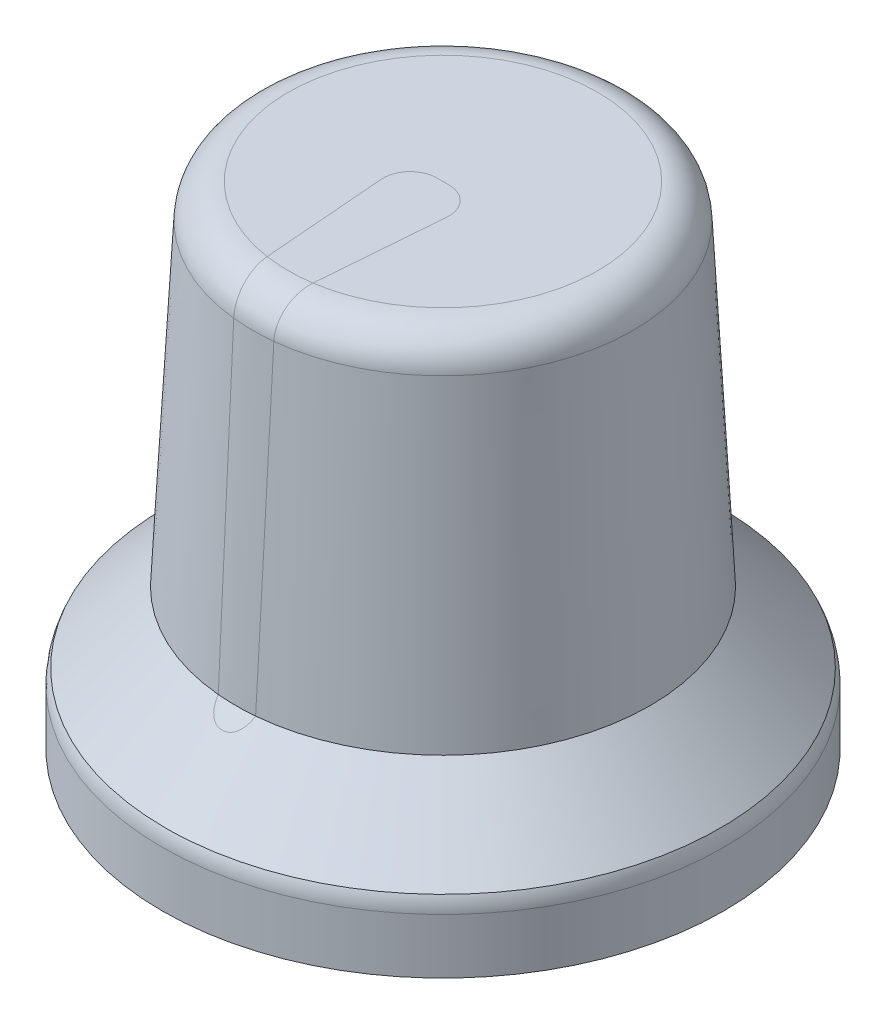
ISO-10303-21;
HEADER;
FILE_DESCRIPTION(('STEP AP214'),'2;1');
FILE_NAME('part.step','',(''),(''),'','','');
FILE_SCHEMA(('AUTOMOTIVE_DESIGN { 1 0 10303 214 1 1 1 1 }'));
ENDSEC;
DATA;
#1=APPLICATION_CONTEXT('core data for automotive mechanical design processes');
#2=APPLICATION_PROTOCOL_DEFINITION('international standard','automotive_design',2000,#1);
#3=PRODUCT_CONTEXT('',#1,'mechanical');
#4=PRODUCT('Part','Part','',(#3));
#5=PRODUCT_RELATED_PRODUCT_CATEGORY('part','',(#4));
#6=PRODUCT_DEFINITION_FORMATION('','',#4);
#7=PRODUCT_DEFINITION_CONTEXT('part definition',#1,'design');
#8=PRODUCT_DEFINITION('design','',#6,#7);
#9=PRODUCT_DEFINITION_SHAPE('','',#8);
#10=(LENGTH_UNIT() NAMED_UNIT(*) SI_UNIT(.MILLI.,.METRE.));
#11=(NAMED_UNIT(*) PLANE_ANGLE_UNIT() SI_UNIT($,.RADIAN.));
#12=(NAMED_UNIT(*) SI_UNIT($,.STERADIAN.) SOLID_ANGLE_UNIT());
#13=UNCERTAINTY_MEASURE_WITH_UNIT(LENGTH_MEASURE(1.E-05),#10,'distance_accuracy_value','');
#14=(GEOMETRIC_REPRESENTATION_CONTEXT(3) GLOBAL_UNCERTAINTY_ASSIGNED_CONTEXT((#13)) GLOBAL_UNIT_ASSIGNED_CONTEXT((#10,
#11,#12)) REPRESENTATION_CONTEXT('',''));
#15=CARTESIAN_POINT('',(0.,0.,0.));
#16=DIRECTION('',(0.,0.,1.));
#17=DIRECTION('',(1.,0.,0.));
#18=AXIS2_PLACEMENT_3D('',#15,#16,#17);
#19=CARTESIAN_POINT('',(0.,14.,0.));
#20=DIRECTION('',(0.,1.,0.));
#21=DIRECTION('',(0.,0.,1.));
#22=AXIS2_PLACEMENT_3D('',#19,#20,#21);
#23=PLANE('',#22);
#24=CARTESIAN_POINT('',(0.,14.,0.));
#25=DIRECTION('',(0.,1.,0.));
#26=DIRECTION('',(0.,0.,1.));
#27=AXIS2_PLACEMENT_3D('',#24,#25,#26);
#28=CIRCLE('',#27,4.40695864882119);
#29=CARTESIAN_POINT('',(0.653643207015868,14.,4.35821466776728));
#30=VERTEX_POINT('',#29);
#31=CARTESIAN_POINT('',(-0.653643207015868,14.,4.35821466776728));
#32=VERTEX_POINT('',#31);
#33=EDGE_CURVE('E238',#30,#32,#28,.T.);
#34=ORIENTED_EDGE('',*,*,#33,.T.);
#35=DIRECTION('',(-0.0792223900197647,0.,-0.996856967131973));
#36=VECTOR('',#35,1.);
#37=CARTESIAN_POINT('',(-0.993723812919556,14.,0.078973391444049));
#38=LINE('',#37,#36);
#39=CARTESIAN_POINT('',(-0.934644670300294,14.,0.822367461195066));
#40=VERTEX_POINT('',#39);
#41=EDGE_CURVE('E12',#32,#40,#38,.T.);
#42=ORIENTED_EDGE('',*,*,#41,.T.);
#43=CARTESIAN_POINT('',(-0.175039661345731,14.,0.762));
#44=DIRECTION('',(0.,1.,0.));
#45=DIRECTION('',(0.,0.,1.));
#46=AXIS2_PLACEMENT_3D('',#43,#44,#45);
#47=CIRCLE('',#46,0.762);
#48=CARTESIAN_POINT('',(-0.175039661345725,14.,0.));
#49=VERTEX_POINT('',#48);
#50=EDGE_CURVE('E53',#40,#49,#47,.F.);
#51=ORIENTED_EDGE('',*,*,#50,.T.);
#52=DIRECTION('',(1.,0.,0.));
#53=VECTOR('',#52,1.);
#54=CARTESIAN_POINT('',(0.,14.,0.));
#55=LINE('',#54,#53);
#56=CARTESIAN_POINT('',(0.175039661345725,14.,0.));
#57=VERTEX_POINT('',#56);
#58=EDGE_CURVE('E197',#49,#57,#55,.T.);
#59=ORIENTED_EDGE('',*,*,#58,.T.);
#60=CARTESIAN_POINT('',(0.175039661345731,14.,0.762));
#61=DIRECTION('',(0.,1.,0.));
#62=DIRECTION('',(0.,0.,1.));
#63=AXIS2_PLACEMENT_3D('',#60,#61,#62);
#64=CIRCLE('',#63,0.762);
#65=CARTESIAN_POINT('',(0.934644670300294,14.,0.822367461195067));
#66=VERTEX_POINT('',#65);
#67=EDGE_CURVE('E247',#57,#66,#64,.F.);
#68=ORIENTED_EDGE('',*,*,#67,.T.);
#69=DIRECTION('',(-0.0792223900197647,0.,0.996856967131973));
#70=VECTOR('',#69,1.);
#71=CARTESIAN_POINT('',(0.993723812919556,14.,0.078973391444049));
#72=LINE('',#71,#70);
#73=EDGE_CURVE('E67',#66,#30,#72,.T.);
#74=ORIENTED_EDGE('',*,*,#73,.T.);
#75=EDGE_LOOP('',(#34,#42,#51,#59,#68,#74));
#76=FACE_BOUND('',#75,.T.);
#77=ADVANCED_FACE('F39',(#76),#23,.T.);
#78=CARTESIAN_POINT('',(0.,12.984,0.));
#79=DIRECTION('',(0.,1.,0.));
#80=DIRECTION('',(0.,0.,1.));
#81=AXIS2_PLACEMENT_3D('',#78,#79,#80);
#82=TOROIDAL_SURFACE('',#81,4.40695864882119,1.016);
#83=CARTESIAN_POINT('',(0.,13.0371733315428,0.));
#84=DIRECTION('',(0.,-1.,0.));
#85=DIRECTION('',(0.,0.,-1.));
#86=AXIS2_PLACEMENT_3D('',#83,#84,#85);
#87=CIRCLE('',#86,5.42156625613183);
#88=CARTESIAN_POINT('',(-0.571537172376414,13.0371733315428,5.39135659460764));
#89=VERTEX_POINT('',#88);
#90=CARTESIAN_POINT('',(0.571537172376414,13.0371733315428,5.39135659460764));
#91=VERTEX_POINT('',#90);
#92=EDGE_CURVE('E239',#89,#91,#87,.T.);
#93=ORIENTED_EDGE('',*,*,#92,.F.);
#94=CARTESIAN_POINT('',(-0.571536329192832,13.0369733315428,5.39136720440404));
#95=CARTESIAN_POINT('',(-0.571655016154139,13.0651791479952,5.38987376392267));
#96=CARTESIAN_POINT('',(-0.571868496683095,13.093307682671,5.38718753402499));
#97=CARTESIAN_POINT('',(-0.57248310536941,13.1492338031138,5.37945390025227));
#98=CARTESIAN_POINT('',(-0.572884217883005,13.1770314162731,5.37440669322303));
#99=CARTESIAN_POINT('',(-0.574364111855624,13.259556836961,5.35578515685113));
#100=CARTESIAN_POINT('',(-0.575719956405008,13.313534923229,5.33872453692961));
#101=CARTESIAN_POINT('',(-0.579129035097453,13.4178432200181,5.29582802944963));
#102=CARTESIAN_POINT('',(-0.581182474954656,13.4681723491785,5.26998955338587));
#103=CARTESIAN_POINT('',(-0.585924749978233,13.5638092461996,5.21031740898163));
#104=CARTESIAN_POINT('',(-0.588613538902339,13.6091173791484,5.17648432250855));
#105=CARTESIAN_POINT('',(-0.594569349835467,13.693812458266,5.10154223073213));
#106=CARTESIAN_POINT('',(-0.597840542378927,13.7331526305856,5.06038074750794));
#107=CARTESIAN_POINT('',(-0.604852401091304,13.8044887108023,4.97215038475021));
#108=CARTESIAN_POINT('',(-0.608593162290523,13.8364831283627,4.92508030944841));
#109=CARTESIAN_POINT('',(-0.6165060797843,13.8928158589675,4.8255119054651));
#110=CARTESIAN_POINT('',(-0.620684579579783,13.917012147588,4.77293375638064));
#111=CARTESIAN_POINT('',(-0.629299362012164,13.9564091787724,4.66453377140287));
#112=CARTESIAN_POINT('',(-0.633735658026397,13.9716094540644,4.60871176718228));
#113=CARTESIAN_POINT('',(-0.642839457789978,13.9929172539448,4.49415846704281));
#114=CARTESIAN_POINT('',(-0.647509858164799,13.9988276300994,4.43539072282587));
#115=CARTESIAN_POINT('',(-0.656864023711063,14.0008567166965,4.31768706488053));
#116=CARTESIAN_POINT('',(-0.661547790307914,13.9969743406208,4.25875113321618));
#117=CARTESIAN_POINT('',(-0.67088504298202,13.9794118078508,4.14126029028994));
#118=CARTESIAN_POINT('',(-0.675536466307262,13.9655565411153,4.08273133467915));
#119=CARTESIAN_POINT('',(-0.684591600407722,13.9282427473239,3.96879039558218));
#120=CARTESIAN_POINT('',(-0.688995278685653,13.9047829637467,3.91337882101004));
#121=CARTESIAN_POINT('',(-0.697451641868727,13.8487148687214,3.80697222871281));
#122=CARTESIAN_POINT('',(-0.701502298068287,13.8160577292954,3.75600273823189));
#123=CARTESIAN_POINT('',(-0.709102419346219,13.7424908373116,3.6603702554822));
#124=CARTESIAN_POINT('',(-0.712651952247882,13.7015822033556,3.61570640979156));
#125=CARTESIAN_POINT('',(-0.719080025830901,13.6133326723346,3.5348218273538));
#126=CARTESIAN_POINT('',(-0.72196875530938,13.5661102243417,3.49847288476241));
#127=CARTESIAN_POINT('',(-0.727047680528455,13.466034569889,3.43456466400671));
#128=CARTESIAN_POINT('',(-0.729238193113523,13.4131839320182,3.40700139898188));
#129=CARTESIAN_POINT('',(-0.732708048448815,13.3073218190601,3.36334013775178));
#130=CARTESIAN_POINT('',(-0.734041576474406,13.2545950766722,3.34656032710931));
#131=CARTESIAN_POINT('',(-0.735501517662688,13.1739466666899,3.32818985703414));
#132=CARTESIAN_POINT('',(-0.735898269976561,13.1467675669619,3.3231975144879));
#133=CARTESIAN_POINT('',(-0.736507766237138,13.0920759749821,3.31552821047364));
#134=CARTESIAN_POINT('',(-0.736720465424107,13.064563403282,3.3128518122183));
#135=CARTESIAN_POINT('',(-0.736839782653421,13.0369733315428,3.3113504410616));
#136=B_SPLINE_CURVE_WITH_KNOTS('',3,(#94,#95,#96,#97,#98,#99,#100,#101,#102,#103,#104,#105,#106,
#107,#108,#109,#110,#111,#112,#113,#114,#115,#116,#117,#118,#119,#120,#121,#122,#123,#124,#125,
#126,#127,#128,#129,#130,#131,#132,#133,#134,#135),.UNSPECIFIED.,.F.,.F.,(4,2,2,2,2,2,2,2,2,2,2,
2,2,2,2,2,2,2,2,2,4),(0.,0.0846841635638511,0.169361267868169,0.338366400009929,
0.507421413462427,0.676464126463118,0.846769956155011,1.01711030771262,1.19039751248792,
1.36369371737415,1.54062019041946,1.71756629454346,1.89769757291265,2.07785242468694,
2.25898234087559,2.44008771893502,2.61817743459876,2.796186219334,2.96139728912773,
3.04421980611975,3.12706245899867),.UNSPECIFIED.);
#137=EDGE_CURVE('E202',#89,#32,#136,.T.);
#138=ORIENTED_EDGE('',*,*,#137,.T.);
#139=ORIENTED_EDGE('',*,*,#33,.F.);
#140=CARTESIAN_POINT('',(0.736839782653421,13.0369733315428,3.3113504410616));
#141=CARTESIAN_POINT('',(0.736719410316078,13.0648032289591,3.31286508866438));
#142=CARTESIAN_POINT('',(0.736504057891761,13.092553532419,3.31557487265998));
#143=CARTESIAN_POINT('',(0.735886059149759,13.1477146546876,3.32335116357332));
#144=CARTESIAN_POINT('',(0.735483447885511,13.1751255360481,3.32841722941294));
#145=CARTESIAN_POINT('',(0.734001632924805,13.2564280387377,3.34706293761754));
#146=CARTESIAN_POINT('',(0.732647675505115,13.309562033856,3.36409981174721));
#147=CARTESIAN_POINT('',(0.729257247532962,13.4121831032369,3.4067616368292));
#148=CARTESIAN_POINT('',(0.727220915065696,13.4616709128707,3.43238485025263));
#149=CARTESIAN_POINT('',(0.72253397061015,13.5557857236497,3.49136076897845));
#150=CARTESIAN_POINT('',(0.719883184483558,13.6004113415523,3.52471566546682));
#151=CARTESIAN_POINT('',(0.713977993947824,13.6847283711545,3.59902079973908));
#152=CARTESIAN_POINT('',(0.710710447120106,13.7242729352931,3.64013640884691));
#153=CARTESIAN_POINT('',(0.703712497041306,13.7961905877355,3.72819175898155));
#154=CARTESIAN_POINT('',(0.699981982014977,13.8285619389222,3.77513290647861));
#155=CARTESIAN_POINT('',(0.692010767720537,13.8864670833441,3.8754348603067));
#156=CARTESIAN_POINT('',(0.687756056704571,13.9116938284027,3.92897197674993));
#157=CARTESIAN_POINT('',(0.678976194336665,13.952983542013,4.03944916596025));
#158=CARTESIAN_POINT('',(0.67445101852813,13.9690456804722,4.09638954646518));
#159=CARTESIAN_POINT('',(0.665157723846627,13.9918127378627,4.21332726506412));
#160=CARTESIAN_POINT('',(0.660386517657042,13.9983175489244,4.27336345092678));
#161=CARTESIAN_POINT('',(0.650825138423442,14.0011093839533,4.39367448297248));
#162=CARTESIAN_POINT('',(0.646034965134749,13.9973962756758,4.45394933223432));
#163=CARTESIAN_POINT('',(0.636581343084039,13.9797947673383,4.57290445342583));
#164=CARTESIAN_POINT('',(0.631917692662406,13.9659236826033,4.63158726284263));
#165=CARTESIAN_POINT('',(0.622846180270884,13.9283265368054,4.74573429031373));
#166=CARTESIAN_POINT('',(0.618438314042932,13.9046006398501,4.80119856194733));
#167=CARTESIAN_POINT('',(0.610083353987672,13.8483669031817,4.90632919659642));
#168=CARTESIAN_POINT('',(0.606129815337474,13.8160117054098,4.95607665495122));
#169=CARTESIAN_POINT('',(0.59872207385771,13.7432166153437,5.04928841873381));
#170=CARTESIAN_POINT('',(0.595267740962998,13.7027788354861,5.09275436077403));
#171=CARTESIAN_POINT('',(0.589033950233684,13.6158896261875,5.17119427805764));
#172=CARTESIAN_POINT('',(0.586241682741368,13.5695846632433,5.20632943748815));
#173=CARTESIAN_POINT('',(0.58132598657078,13.4716275604113,5.26818374376106));
#174=CARTESIAN_POINT('',(0.579202555375655,13.419975440646,5.29490292227307));
#175=CARTESIAN_POINT('',(0.575735894951153,13.3141353043239,5.33852398187482));
#176=CARTESIAN_POINT('',(0.574374530717973,13.2600426422525,5.35565405609136));
#177=CARTESIAN_POINT('',(0.572888858477271,13.1773375530109,5.37434830052969));
#178=CARTESIAN_POINT('',(0.572486243242243,13.1494802656902,5.37941441633371));
#179=CARTESIAN_POINT('',(0.571869439613676,13.0934322624955,5.38717566911005));
#180=CARTESIAN_POINT('',(0.571655271253112,13.0652415114952,5.38987055400704));
#181=CARTESIAN_POINT('',(0.571536329192832,13.0369733315428,5.39136720440404));
#182=B_SPLINE_CURVE_WITH_KNOTS('',3,(#140,#141,#142,#143,#144,#145,#146,#147,#148,#149,#150,
#151,#152,#153,#154,#155,#156,#157,#158,#159,#160,#161,#162,#163,#164,#165,#166,#167,#168,#169,
#170,#171,#172,#173,#174,#175,#176,#177,#178,#179,#180,#181),.UNSPECIFIED.,.F.,.F.,(4,2,2,2,2,2,
2,2,2,2,2,2,2,2,2,2,2,2,2,2,4),(0.,0.0835606191726941,0.167105602721881,0.333683991775471,
0.50022869241483,0.66682065023574,0.837474748899495,1.00817012933791,1.18536068507047,
1.3625672874503,1.54343377258053,1.72430259857603,1.90486383042926,2.08542205560027,
2.26297690566507,2.44048541112268,2.61421230753932,2.78793855020811,2.95733269196179,
3.04219529365379,3.12706691563305),.UNSPECIFIED.);
#183=EDGE_CURVE('E172',#30,#91,#182,.T.);
#184=ORIENTED_EDGE('',*,*,#183,.T.);
#185=EDGE_LOOP('',(#93,#138,#139,#184));
#186=FACE_BOUND('',#185,.T.);
#187=ADVANCED_FACE('F213',(#186),#82,.T.);
#188=CARTESIAN_POINT('',(0.,2.,0.));
#189=DIRECTION('',(0.,-1.,0.));
#190=DIRECTION('',(0.,0.,1.));
#191=AXIS2_PLACEMENT_3D('',#188,#189,#190);
#192=CONICAL_SURFACE('',#191,6.,0.0523598775598299);
#193=CARTESIAN_POINT('',(-0.571538017153123,13.0373733315428,5.3913459647649));
#194=CARTESIAN_POINT('',(-0.565800943931646,11.6790595651946,5.4635356754054));
#195=CARTESIAN_POINT('',(-0.560067373742862,10.3207434443046,5.53568130731329));
#196=CARTESIAN_POINT('',(-0.54860723943114,7.60410649354994,5.67988441365807));
#197=CARTESIAN_POINT('',(-0.542880675308202,6.24578566368531,5.75194188809497));
#198=CARTESIAN_POINT('',(-0.537157614217956,4.88746247927883,5.82395528379927));
#199=B_SPLINE_CURVE_WITH_KNOTS('',3,(#193,#194,#195,#196,#197,#198),.UNSPECIFIED.,.F.,.F.,(4,2,
4),(0.,4.08072848309004,8.1614569658523),.UNSPECIFIED.);
#200=CARTESIAN_POINT('',(-0.537173508652691,4.89123472116881,5.82375528379927));
#201=VERTEX_POINT('',#200);
#202=EDGE_CURVE('E171',#89,#201,#199,.T.);
#203=ORIENTED_EDGE('',*,*,#202,.F.);
#204=ORIENTED_EDGE('',*,*,#92,.T.);
#205=CARTESIAN_POINT('',(0.537157614217956,4.88746247927883,5.82395528379927));
#206=CARTESIAN_POINT('',(0.542880675308202,6.24578566368531,5.75194188809497));
#207=CARTESIAN_POINT('',(0.548607239431141,7.60410649354994,5.67988441365807));
#208=CARTESIAN_POINT('',(0.560067373742862,10.3207434443046,5.53568130731329));
#209=CARTESIAN_POINT('',(0.565800943931646,11.6790595651946,5.4635356754054));
#210=CARTESIAN_POINT('',(0.571538017153123,13.0373733315428,5.3913459647649));
#211=B_SPLINE_CURVE_WITH_KNOTS('',3,(#205,#206,#207,#208,#209,#210),.UNSPECIFIED.,.F.,.F.,(4,2,
4),(0.,4.08072848276226,8.1614569658523),.UNSPECIFIED.);
#212=CARTESIAN_POINT('',(0.537173508652691,4.89123472116881,5.82375528379927));
#213=VERTEX_POINT('',#212);
#214=EDGE_CURVE('E111',#213,#91,#211,.T.);
#215=ORIENTED_EDGE('',*,*,#214,.F.);
#216=CARTESIAN_POINT('',(0.444658032573755,0.200541092703562,6.07806223493165));
#217=CARTESIAN_POINT('',(0.451318954583719,0.369487913061375,6.06869686351549));
#218=CARTESIAN_POINT('',(0.457494964247645,0.538454218397463,6.05935333013892));
#219=CARTESIAN_POINT('',(0.468985643776357,0.876418039905435,6.040709811422));
#220=CARTESIAN_POINT('',(0.474300316530228,1.04541555597073,6.03140982593568));
#221=CARTESIAN_POINT('',(0.49284939153886,1.68024872149898,5.99655873067516));
#222=CARTESIAN_POINT('',(0.503600798712075,2.1461654601841,5.97115062563569));
#223=CARTESIAN_POINT('',(0.520626425996951,3.07809903088003,5.92066217251602));
#224=CARTESIAN_POINT('',(0.52690059709809,3.54411586393067,5.89558182802663));
#225=CARTESIAN_POINT('',(0.533982954408948,4.30509885183141,5.85489631661346));
#226=CARTESIAN_POINT('',(0.535952214261021,4.60004958586175,5.83919304308407));
#227=CARTESIAN_POINT('',(0.538607846090309,5.23319750960671,5.80562543847901));
#228=CARTESIAN_POINT('',(0.539063872948869,5.57139681018639,5.78778172024925));
#229=CARTESIAN_POINT('',(0.538415216019234,6.03544728420639,5.76341655309661));
#230=CARTESIAN_POINT('',(0.538110700128951,6.16129605447748,5.75682077625488));
#231=CARTESIAN_POINT('',(0.53767931676555,6.28714490026927,5.75023695296928));
#232=B_SPLINE_CURVE_WITH_KNOTS('',3,(#216,#217,#218,#219,#220,#221,#222,#223,#224,#225,#226,
#227,#228,#229,#230,#231),.UNSPECIFIED.,.F.,.F.,(4,2,2,2,2,2,2,4),(0.,0.508009729697741,
1.01601775540124,2.41618503398703,3.81636763941238,4.70248942389726,5.71849345883246,
6.09655873327584),.UNSPECIFIED.);
#233=CARTESIAN_POINT('',(0.531239848984814,4.01035842037481,5.87065444180602));
#234=VERTEX_POINT('',#233);
#235=EDGE_CURVE('E43',#234,#213,#232,.T.);
#236=ORIENTED_EDGE('',*,*,#235,.F.);
#237=CARTESIAN_POINT('',(0.,4.01035842037481,0.));
#238=DIRECTION('',(0.,1.,0.));
#239=DIRECTION('',(0.,0.,1.));
#240=AXIS2_PLACEMENT_3D('',#237,#238,#239);
#241=CIRCLE('',#240,5.89464157962519);
#242=CARTESIAN_POINT('',(-0.531239848984814,4.01035842037481,5.87065444180602));
#243=VERTEX_POINT('',#242);
#244=EDGE_CURVE('E108',#234,#243,#241,.T.);
#245=ORIENTED_EDGE('',*,*,#244,.T.);
#246=CARTESIAN_POINT('',(-0.537679316766016,6.28714490026927,5.75023695296923));
#247=CARTESIAN_POINT('',(-0.538835931171026,5.94894028323482,5.7679302513103));
#248=CARTESIAN_POINT('',(-0.539079646642934,5.61073797620673,5.78570976856965));
#249=CARTESIAN_POINT('',(-0.538111071184778,5.14669620092487,5.81022347229132));
#250=CARTESIAN_POINT('',(-0.537716908089445,5.02085104756666,5.8168834126471));
#251=CARTESIAN_POINT('',(-0.535952887114987,4.60004979651403,5.83919302860998));
#252=CARTESIAN_POINT('',(-0.533983672361815,4.30509879760748,5.85489631582615));
#253=CARTESIAN_POINT('',(-0.5282817739157,3.69260324889965,5.88764304060093));
#254=CARTESIAN_POINT('',(-0.524425452171569,3.37506039039615,5.90469691281602));
#255=CARTESIAN_POINT('',(-0.514729415733467,2.74001389630194,5.93895673696308));
#256=CARTESIAN_POINT('',(-0.50888970724372,2.42251026059164,5.95616268841915));
#257=CARTESIAN_POINT('',(-0.494964126497622,1.78754227776465,5.9907280106649));
#258=CARTESIAN_POINT('',(-0.486878135882271,1.47007793360034,6.00808738949214));
#259=CARTESIAN_POINT('',(-0.467956363347669,0.835235060674129,6.04295961587145));
#260=CARTESIAN_POINT('',(-0.457120535676034,0.517856533428029,6.06047246597232));
#261=CARTESIAN_POINT('',(-0.444658032573755,0.200541092703562,6.07806223493165));
#262=B_SPLINE_CURVE_WITH_KNOTS('',3,(#246,#247,#248,#249,#250,#251,#252,#253,#254,#255,#256,
#257,#258,#259,#260,#261),.UNSPECIFIED.,.F.,.F.,(4,2,2,2,2,2,2,4),(0.,1.0160039273998,
1.39406933534565,2.28019111983054,3.23425701565729,4.18831992710151,5.14243311867557,
6.0965621860319),.UNSPECIFIED.);
#263=EDGE_CURVE('E115',#201,#243,#262,.T.);
#264=ORIENTED_EDGE('',*,*,#263,.F.);
#265=EDGE_LOOP('',(#203,#204,#215,#236,#245,#264));
#266=FACE_BOUND('',#265,.T.);
#267=ADVANCED_FACE('F105',(#266),#192,.T.);
#268=CARTESIAN_POINT('',(0.,4.01035842037482,0.));
#269=DIRECTION('',(0.,-1.,0.));
#270=DIRECTION('',(0.,0.,-1.));
#271=AXIS2_PLACEMENT_3D('',#268,#269,#270);
#272=CONICAL_SURFACE('',#271,5.89464157962519,0.785398163397444);
#273=CARTESIAN_POINT('',(0.,2.,0.));
#274=DIRECTION('',(0.,1.,0.));
#275=DIRECTION('',(0.,0.,1.));
#276=AXIS2_PLACEMENT_3D('',#273,#274,#275);
#277=CIRCLE('',#276,7.905);
#278=CARTESIAN_POINT('',(0.,2.,7.905));
#279=VERTEX_POINT('',#278);
#280=EDGE_CURVE('E135',#279,#279,#277,.F.);
#281=ORIENTED_EDGE('',*,*,#280,.F.);
#282=EDGE_LOOP('',(#281));
#283=FACE_BOUND('',#282,.T.);
#284=CARTESIAN_POINT('',(-0.531275332515906,4.01055842037482,5.87045041344141));
#285=CARTESIAN_POINT('',(-0.526000236646425,3.98093788298891,5.90065906731688));
#286=CARTESIAN_POINT('',(-0.517957907543758,3.95159398857005,5.93084405891178));
#287=CARTESIAN_POINT('',(-0.495778506311457,3.89399034797439,5.99054769617214));
#288=CARTESIAN_POINT('',(-0.481584973838051,3.86574335270778,6.02005743585917));
#289=CARTESIAN_POINT('',(-0.449949006759173,3.81661389408965,6.07175718986987));
#290=CARTESIAN_POINT('',(-0.433638058415408,3.79535259219076,6.09427183462794));
#291=CARTESIAN_POINT('',(-0.39645054527231,3.75497026748056,6.13727085240947));
#292=CARTESIAN_POINT('',(-0.375589041169211,3.73584249184207,6.15776160622907));
#293=CARTESIAN_POINT('',(-0.334282285076097,3.7044690269956,6.19154224038864));
#294=CARTESIAN_POINT('',(-0.314767910513004,3.69163732893489,6.20542188418483));
#295=CARTESIAN_POINT('',(-0.272928409353564,3.66831676239685,6.23074537772231));
#296=CARTESIAN_POINT('',(-0.250605347579416,3.65782618838497,6.24219100038664));
#297=CARTESIAN_POINT('',(-0.207384710932547,3.64129968230505,6.2602980353594));
#298=CARTESIAN_POINT('',(-0.186859974493738,3.63481429036478,6.26743728584934));
#299=CARTESIAN_POINT('',(-0.144498216537983,3.62427281476564,6.27910073296041));
#300=CARTESIAN_POINT('',(-0.122663784836169,3.62021210013652,6.28362991405702));
#301=CARTESIAN_POINT('',(-0.0889590715715206,3.61607998563978,6.28830147690126));
#302=CARTESIAN_POINT('',(-0.0773415955354536,3.61502926326396,6.28950601552128));
#303=CARTESIAN_POINT('',(-0.0540076961249744,3.61366556282594,6.29111349397853));
#304=CARTESIAN_POINT('',(-0.0422912659631941,3.61335263578916,6.2915163783736));
#305=CARTESIAN_POINT('',(-0.0305701693496738,3.61341546059063,6.29151027029927));
#306=B_SPLINE_CURVE_WITH_KNOTS('',3,(#284,#285,#286,#287,#288,#289,#290,#291,#292,#293,#294,
#295,#296,#297,#298,#299,#300,#301,#302,#303,#304,#305),.UNSPECIFIED.,.F.,.F.,(4,2,2,2,2,2,2,2,
2,2,4),(0.,0.12802979500426,0.257260493410055,0.361910328333769,0.466218927733467,
0.547428314998559,0.628578345788452,0.696334546193623,0.763960919412239,0.799096253790283,
0.834234018033435),.UNSPECIFIED.);
#307=CARTESIAN_POINT('',(-0.0307701693496446,3.6134144462627,6.29151030966924));
#308=VERTEX_POINT('',#307);
#309=EDGE_CURVE('E134',#243,#308,#306,.T.);
#310=ORIENTED_EDGE('',*,*,#309,.F.);
#311=ORIENTED_EDGE('',*,*,#244,.F.);
#312=CARTESIAN_POINT('',(0.0305701693496448,3.61341546059074,6.29151027029916));
#313=CARTESIAN_POINT('',(0.0537754529124219,3.61326043818161,6.29155742275828));
#314=CARTESIAN_POINT('',(0.0769413161420778,3.61463107464139,6.28994112688153));
#315=CARTESIAN_POINT('',(0.122350882927272,3.62015061838682,6.283697899732));
#316=CARTESIAN_POINT('',(0.144600232767806,3.62427844962596,6.27909381471463));
#317=CARTESIAN_POINT('',(0.187658478947758,3.63503327436973,6.26719568964947));
#318=CARTESIAN_POINT('',(0.208470340190275,3.64165493026962,6.25990739542332));
#319=CARTESIAN_POINT('',(0.248343172623162,3.65702528395175,6.2430700181231));
#320=CARTESIAN_POINT('',(0.26740075613018,3.66577798296824,6.23351668311601));
#321=CARTESIAN_POINT('',(0.30995423574003,3.68846002249931,6.20885898659197));
#322=CARTESIAN_POINT('',(0.332615267834697,3.70312300907141,6.19298915924338));
#323=CARTESIAN_POINT('',(0.37414559439469,3.73483021684883,6.15885404208104));
#324=CARTESIAN_POINT('',(0.393007833526176,3.75187877097316,6.14058439725039));
#325=CARTESIAN_POINT('',(0.433003341876077,3.79398525857342,6.09570503552849));
#326=CARTESIAN_POINT('',(0.45261725189322,3.8197567351263,6.06841578911171));
#327=CARTESIAN_POINT('',(0.485591431157198,3.87331980069036,6.01213050292267));
#328=CARTESIAN_POINT('',(0.498946072509361,3.90111318182169,5.98313295342923));
#329=CARTESIAN_POINT('',(0.514298518313637,3.94281568114786,5.93996414522881));
#330=CARTESIAN_POINT('',(0.518560519996458,3.95625629838154,5.92610079394947));
#331=CARTESIAN_POINT('',(0.52583389600037,3.98329123396739,5.89831809648994));
#332=CARTESIAN_POINT('',(0.528850655036718,3.99688462377831,5.88439925988078));
#333=CARTESIAN_POINT('',(0.5312753325205,4.01055842037379,5.87045041344205));
#334=B_SPLINE_CURVE_WITH_KNOTS('',3,(#312,#313,#314,#315,#316,#317,#318,#319,#320,#321,#322,
#323,#324,#325,#326,#327,#328,#329,#330,#331,#332,#333),.UNSPECIFIED.,.F.,.F.,(4,2,2,2,2,2,2,2,
2,2,4),(0.,0.0694362395327634,0.13834769038072,0.207112478630363,0.276007388647478,
0.369426029602071,0.463016604620451,0.589394643049526,0.715886094774845,0.775175040160468,
0.834204850602767),.UNSPECIFIED.);
#335=CARTESIAN_POINT('',(0.0307701693496448,3.6134144462627,6.29151030966924));
#336=VERTEX_POINT('',#335);
#337=EDGE_CURVE('E119',#336,#234,#334,.T.);
#338=ORIENTED_EDGE('',*,*,#337,.F.);
#339=CARTESIAN_POINT('',(-2.25410891227027,3.22187880066129,6.29151030966924));
#340=CARTESIAN_POINT('',(-2.07027968450138,3.2839381665761,6.29151030966924));
#341=CARTESIAN_POINT('',(-1.88424088970398,3.33991424362106,6.29151030966924));
#342=CARTESIAN_POINT('',(-1.50818178985836,3.43778203993269,6.29151030966924));
#343=CARTESIAN_POINT('',(-1.31815529408887,3.47964982522107,6.29151030966924));
#344=CARTESIAN_POINT('',(-0.940710211613406,3.54618603854226,6.29151030966924));
#345=CARTESIAN_POINT('',(-0.75337462576806,3.5713159544371,6.29151030966924));
#346=CARTESIAN_POINT('',(-0.37735850555959,3.60496071292714,6.29151030966924));
#347=CARTESIAN_POINT('',(-0.188679252779795,3.61348969033078,6.29151030966924));
#348=CARTESIAN_POINT('',(0.188679252779795,3.61348969033078,6.29151030966924));
#349=CARTESIAN_POINT('',(0.37735850555959,3.60496071292714,6.29151030966924));
#350=CARTESIAN_POINT('',(0.75337462576806,3.5713159544371,6.29151030966924));
#351=CARTESIAN_POINT('',(0.940710211613406,3.54618603854226,6.29151030966924));
#352=CARTESIAN_POINT('',(1.31815529408887,3.47964982522107,6.29151030966924));
#353=CARTESIAN_POINT('',(1.50818178985836,3.43778203993269,6.29151030966924));
#354=CARTESIAN_POINT('',(1.88424088970398,3.33991424362106,6.29151030966924));
#355=CARTESIAN_POINT('',(2.07027968450138,3.2839381665761,6.29151030966924));
#356=CARTESIAN_POINT('',(2.25410891227027,3.22187880066129,6.29151030966924));
#357=B_SPLINE_CURVE_WITH_KNOTS('',3,(#339,#340,#341,#342,#343,#344,#345,#346,#347,#348,#349,
#350,#351,#352,#353,#354,#355,#356),.UNSPECIFIED.,.F.,.F.,(4,2,2,2,2,2,2,2,4),(0.,
0.582183634567453,1.16534999866929,1.73168673089937,2.29754104648512,2.86339536207086,
3.42973209430094,4.01289845840278,4.59508209297023),.UNSPECIFIED.);
#358=EDGE_CURVE('E123',#308,#336,#357,.T.);
#359=ORIENTED_EDGE('',*,*,#358,.F.);
#360=EDGE_LOOP('',(#310,#311,#338,#359));
#361=FACE_BOUND('',#360,.T.);
#362=ADVANCED_FACE('F133',(#283,#361),#272,.T.);
#363=CARTESIAN_POINT('',(0.,2.,0.));
#364=DIRECTION('',(0.,-1.,0.));
#365=DIRECTION('',(0.,0.,-1.));
#366=AXIS2_PLACEMENT_3D('',#363,#364,#365);
#367=CYLINDRICAL_SURFACE('',#366,8.);
#368=CARTESIAN_POINT('',(0.,1.57103030410062,0.));
#369=DIRECTION('',(0.,1.,0.));
#370=DIRECTION('',(0.,0.,1.));
#371=AXIS2_PLACEMENT_3D('',#368,#369,#370);
#372=CIRCLE('',#371,8.);
#373=CARTESIAN_POINT('',(0.,1.57103030410062,8.));
#374=VERTEX_POINT('',#373);
#375=EDGE_CURVE('E126',#374,#374,#372,.F.);
#376=ORIENTED_EDGE('',*,*,#375,.T.);
#377=EDGE_LOOP('',(#376));
#378=FACE_BOUND('',#377,.T.);
#379=CARTESIAN_POINT('',(0.,0.,0.));
#380=DIRECTION('',(0.,1.,0.));
#381=DIRECTION('',(0.,0.,1.));
#382=AXIS2_PLACEMENT_3D('',#379,#380,#381);
#383=CIRCLE('',#382,8.);
#384=CARTESIAN_POINT('',(0.,0.,8.));
#385=VERTEX_POINT('',#384);
#386=EDGE_CURVE('E242',#385,#385,#383,.T.);
#387=ORIENTED_EDGE('',*,*,#386,.T.);
#388=EDGE_LOOP('',(#387));
#389=FACE_BOUND('',#388,.T.);
#390=ADVANCED_FACE('F214',(#378,#389),#367,.T.);
#391=CARTESIAN_POINT('',(0.,0.,0.));
#392=DIRECTION('',(0.,1.,0.));
#393=DIRECTION('',(0.,0.,1.));
#394=AXIS2_PLACEMENT_3D('',#391,#392,#393);
#395=PLANE('',#394);
#396=ORIENTED_EDGE('',*,*,#386,.F.);
#397=EDGE_LOOP('',(#396));
#398=FACE_BOUND('',#397,.T.);
#399=ADVANCED_FACE('F182',(#398),#395,.F.);
#400=EDGE_CURVE('E131',#91,#89,#87,.T.);
#401=ORIENTED_EDGE('',*,*,#400,.T.);
#402=ORIENTED_EDGE('',*,*,#202,.T.);
#403=ORIENTED_EDGE('',*,*,#263,.T.);
#404=EDGE_CURVE('E121',#243,#234,#241,.T.);
#405=ORIENTED_EDGE('',*,*,#404,.T.);
#406=ORIENTED_EDGE('',*,*,#235,.T.);
#407=ORIENTED_EDGE('',*,*,#214,.T.);
#408=EDGE_LOOP('',(#401,#402,#403,#405,#406,#407));
#409=FACE_BOUND('',#408,.T.);
#410=ADVANCED_FACE('F129',(#409),#192,.T.);
#411=ORIENTED_EDGE('',*,*,#41,.F.);
#412=EDGE_CURVE('E234',#32,#30,#28,.T.);
#413=ORIENTED_EDGE('',*,*,#412,.T.);
#414=ORIENTED_EDGE('',*,*,#73,.F.);
#415=ORIENTED_EDGE('',*,*,#67,.F.);
#416=ORIENTED_EDGE('',*,*,#58,.F.);
#417=ORIENTED_EDGE('',*,*,#50,.F.);
#418=EDGE_LOOP('',(#411,#413,#414,#415,#416,#417));
#419=FACE_BOUND('',#418,.T.);
#420=ADVANCED_FACE('F181',(#419),#23,.T.);
#421=ORIENTED_EDGE('',*,*,#137,.F.);
#422=ORIENTED_EDGE('',*,*,#400,.F.);
#423=ORIENTED_EDGE('',*,*,#183,.F.);
#424=ORIENTED_EDGE('',*,*,#412,.F.);
#425=EDGE_LOOP('',(#421,#422,#423,#424));
#426=FACE_BOUND('',#425,.T.);
#427=ADVANCED_FACE('F209',(#426),#82,.T.);
#428=ORIENTED_EDGE('',*,*,#404,.F.);
#429=ORIENTED_EDGE('',*,*,#309,.T.);
#430=ORIENTED_EDGE('',*,*,#358,.T.);
#431=ORIENTED_EDGE('',*,*,#337,.T.);
#432=EDGE_LOOP('',(#428,#429,#430,#431));
#433=FACE_BOUND('',#432,.T.);
#434=ADVANCED_FACE('F120',(#433),#272,.T.);
#435=CARTESIAN_POINT('',(0.,1.57103030410062,0.));
#436=DIRECTION('',(0.,1.,0.));
#437=DIRECTION('',(0.,0.,1.));
#438=AXIS2_PLACEMENT_3D('',#435,#436,#437);
#439=TOROIDAL_SURFACE('',#438,6.984,1.016);
#440=ORIENTED_EDGE('',*,*,#375,.F.);
#441=EDGE_LOOP('',(#440));
#442=FACE_BOUND('',#441,.T.);
#443=ORIENTED_EDGE('',*,*,#280,.T.);
#444=EDGE_LOOP('',(#443));
#445=FACE_BOUND('',#444,.T.);
#446=ADVANCED_FACE('F200',(#442,#445),#439,.T.);
#447=CLOSED_SHELL('',(#77,#187,#267,#362,#390,#399,#410,#420,#427,#434,#446));
#448=MANIFOLD_SOLID_BREP('B2',#447);
#449=ADVANCED_BREP_SHAPE_REPRESENTATION('',(#18,#448),#14);
#450=SHAPE_DEFINITION_REPRESENTATION(#9,#449);
ENDSEC;
END-ISO-10303-21;
